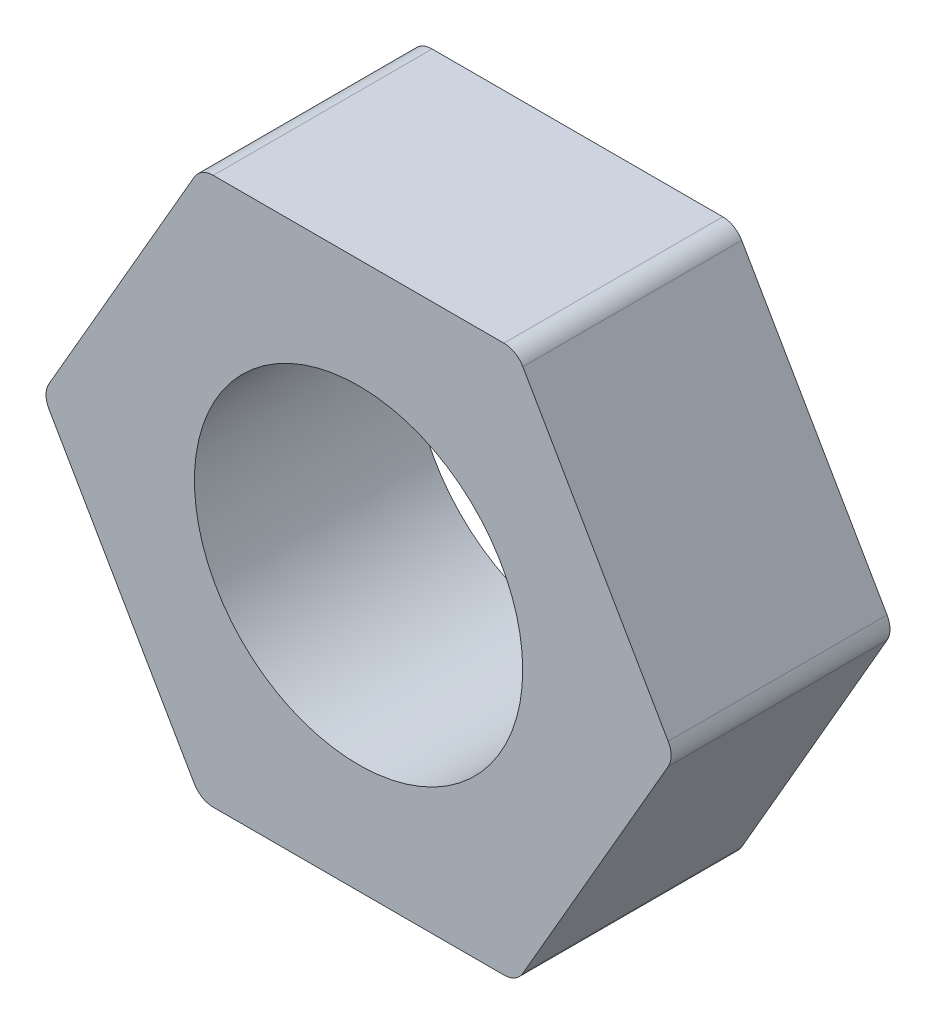
ISO-10303-21;
HEADER;
FILE_DESCRIPTION(('STEP AP214'),'2;1');
FILE_NAME('part.step','',(''),(''),'','','');
FILE_SCHEMA(('AUTOMOTIVE_DESIGN { 1 0 10303 214 1 1 1 1 }'));
ENDSEC;
DATA;
#1=APPLICATION_CONTEXT('core data for automotive mechanical design processes');
#2=APPLICATION_PROTOCOL_DEFINITION('international standard','automotive_design',2000,#1);
#3=PRODUCT_CONTEXT('',#1,'mechanical');
#4=PRODUCT('Part','Part','',(#3));
#5=PRODUCT_RELATED_PRODUCT_CATEGORY('part','',(#4));
#6=PRODUCT_DEFINITION_FORMATION('','',#4);
#7=PRODUCT_DEFINITION_CONTEXT('part definition',#1,'design');
#8=PRODUCT_DEFINITION('design','',#6,#7);
#9=PRODUCT_DEFINITION_SHAPE('','',#8);
#10=(LENGTH_UNIT() NAMED_UNIT(*) SI_UNIT(.MILLI.,.METRE.));
#11=(NAMED_UNIT(*) PLANE_ANGLE_UNIT() SI_UNIT($,.RADIAN.));
#12=(NAMED_UNIT(*) SI_UNIT($,.STERADIAN.) SOLID_ANGLE_UNIT());
#13=UNCERTAINTY_MEASURE_WITH_UNIT(LENGTH_MEASURE(1.E-05),#10,'distance_accuracy_value','');
#14=(GEOMETRIC_REPRESENTATION_CONTEXT(3) GLOBAL_UNCERTAINTY_ASSIGNED_CONTEXT((#13)) GLOBAL_UNIT_ASSIGNED_CONTEXT((#10,
#11,#12)) REPRESENTATION_CONTEXT('',''));
#15=CARTESIAN_POINT('',(0.,0.,0.));
#16=DIRECTION('',(0.,0.,1.));
#17=DIRECTION('',(1.,0.,0.));
#18=AXIS2_PLACEMENT_3D('',#15,#16,#17);
#19=CARTESIAN_POINT('',(485.116224765445,0.,40.));
#20=DIRECTION('',(0.,0.,-1.));
#21=DIRECTION('',(-1.,0.,0.));
#22=AXIS2_PLACEMENT_3D('',#19,#20,#21);
#23=CYLINDRICAL_SURFACE('',#22,4.00000000000002);
#24=CARTESIAN_POINT('',(485.116224765445,0.,0.));
#25=DIRECTION('',(0.,0.,1.));
#26=DIRECTION('',(1.,0.,0.));
#27=AXIS2_PLACEMENT_3D('',#24,#25,#26);
#28=CIRCLE('',#27,4.00000000000002);
#29=CARTESIAN_POINT('',(488.580326380583,2.00000000000006,0.));
#30=VERTEX_POINT('',#29);
#31=CARTESIAN_POINT('',(488.580326380583,-1.99999999999997,0.));
#32=VERTEX_POINT('',#31);
#33=EDGE_CURVE('E162',#30,#32,#28,.F.);
#34=ORIENTED_EDGE('',*,*,#33,.F.);
#35=DIRECTION('',(0.,0.,-1.));
#36=VECTOR('',#35,1.);
#37=CARTESIAN_POINT('',(488.580326380583,2.00000000000006,40.));
#38=LINE('',#37,#36);
#39=CARTESIAN_POINT('',(488.580326380583,2.00000000000006,40.));
#40=VERTEX_POINT('',#39);
#41=EDGE_CURVE('E11',#40,#30,#38,.T.);
#42=ORIENTED_EDGE('',*,*,#41,.F.);
#43=CARTESIAN_POINT('',(485.116224765445,0.,40.));
#44=DIRECTION('',(0.,0.,1.));
#45=DIRECTION('',(1.,0.,0.));
#46=AXIS2_PLACEMENT_3D('',#43,#44,#45);
#47=CIRCLE('',#46,4.00000000000002);
#48=CARTESIAN_POINT('',(488.580326380583,-1.99999999999997,40.));
#49=VERTEX_POINT('',#48);
#50=EDGE_CURVE('E188',#40,#49,#47,.F.);
#51=ORIENTED_EDGE('',*,*,#50,.T.);
#52=DIRECTION('',(0.,0.,-1.));
#53=VECTOR('',#52,1.);
#54=CARTESIAN_POINT('',(488.580326380583,-1.99999999999997,40.));
#55=LINE('',#54,#53);
#56=EDGE_CURVE('E104',#49,#32,#55,.T.);
#57=ORIENTED_EDGE('',*,*,#56,.T.);
#58=EDGE_LOOP('',(#34,#42,#51,#57));
#59=FACE_BOUND('',#58,.T.);
#60=ADVANCED_FACE('F41',(#59),#23,.T.);
#61=CARTESIAN_POINT('',(367.301270189222,212.061487217439,40.));
#62=DIRECTION('',(-0.866025403784438,-0.5,0.));
#63=DIRECTION('',(0.5,-0.866025403784438,0.));
#64=AXIS2_PLACEMENT_3D('',#61,#62,#63);
#65=PLANE('',#64);
#66=DIRECTION('',(-0.5,0.866025403784438,0.));
#67=VECTOR('',#66,1.);
#68=CARTESIAN_POINT('',(367.301270189222,212.061487217439,0.));
#69=LINE('',#68,#67);
#70=CARTESIAN_POINT('',(462.02221399786,48.,0.));
#71=VERTEX_POINT('',#70);
#72=EDGE_CURVE('E165',#30,#71,#69,.T.);
#73=ORIENTED_EDGE('',*,*,#72,.T.);
#74=DIRECTION('',(0.,0.,-1.));
#75=VECTOR('',#74,1.);
#76=CARTESIAN_POINT('',(462.02221399786,48.,40.));
#77=LINE('',#76,#75);
#78=CARTESIAN_POINT('',(462.02221399786,48.,40.));
#79=VERTEX_POINT('',#78);
#80=EDGE_CURVE('E49',#79,#71,#77,.T.);
#81=ORIENTED_EDGE('',*,*,#80,.F.);
#82=DIRECTION('',(-0.5,0.866025403784438,0.));
#83=VECTOR('',#82,1.);
#84=CARTESIAN_POINT('',(367.301270189222,212.061487217439,40.));
#85=LINE('',#84,#83);
#86=EDGE_CURVE('E258',#40,#79,#85,.T.);
#87=ORIENTED_EDGE('',*,*,#86,.F.);
#88=ORIENTED_EDGE('',*,*,#41,.T.);
#89=EDGE_LOOP('',(#73,#81,#87,#88));
#90=FACE_BOUND('',#89,.T.);
#91=ADVANCED_FACE('F261',(#90),#65,.F.);
#92=CARTESIAN_POINT('',(458.558112382723,46.,40.));
#93=DIRECTION('',(0.,0.,-1.));
#94=DIRECTION('',(-1.,0.,0.));
#95=AXIS2_PLACEMENT_3D('',#92,#93,#94);
#96=CYLINDRICAL_SURFACE('',#95,3.99999999999998);
#97=CARTESIAN_POINT('',(458.558112382723,46.,0.));
#98=DIRECTION('',(0.,0.,1.));
#99=DIRECTION('',(1.,0.,0.));
#100=AXIS2_PLACEMENT_3D('',#97,#98,#99);
#101=CIRCLE('',#100,3.99999999999998);
#102=CARTESIAN_POINT('',(458.558112382723,50.,0.));
#103=VERTEX_POINT('',#102);
#104=EDGE_CURVE('E167',#71,#103,#101,.T.);
#105=ORIENTED_EDGE('',*,*,#104,.T.);
#106=DIRECTION('',(0.,0.,-1.));
#107=VECTOR('',#106,1.);
#108=CARTESIAN_POINT('',(458.558112382723,50.,40.));
#109=LINE('',#108,#107);
#110=CARTESIAN_POINT('',(458.558112382723,50.,40.));
#111=VERTEX_POINT('',#110);
#112=EDGE_CURVE('E207',#111,#103,#109,.T.);
#113=ORIENTED_EDGE('',*,*,#112,.F.);
#114=CARTESIAN_POINT('',(458.558112382723,46.,40.));
#115=DIRECTION('',(0.,0.,1.));
#116=DIRECTION('',(1.,0.,0.));
#117=AXIS2_PLACEMENT_3D('',#114,#115,#116);
#118=CIRCLE('',#117,3.99999999999998);
#119=EDGE_CURVE('E216',#79,#111,#118,.T.);
#120=ORIENTED_EDGE('',*,*,#119,.F.);
#121=ORIENTED_EDGE('',*,*,#80,.T.);
#122=EDGE_LOOP('',(#105,#113,#120,#121));
#123=FACE_BOUND('',#122,.T.);
#124=ADVANCED_FACE('F214',(#123),#96,.T.);
#125=CARTESIAN_POINT('',(0.,50.,40.));
#126=DIRECTION('',(0.,-1.,0.));
#127=DIRECTION('',(0.,0.,-1.));
#128=AXIS2_PLACEMENT_3D('',#125,#126,#127);
#129=PLANE('',#128);
#130=DIRECTION('',(-1.,0.,0.));
#131=VECTOR('',#130,1.);
#132=CARTESIAN_POINT('',(0.,50.,0.));
#133=LINE('',#132,#131);
#134=CARTESIAN_POINT('',(405.441887617277,50.,0.));
#135=VERTEX_POINT('',#134);
#136=EDGE_CURVE('E169',#103,#135,#133,.T.);
#137=ORIENTED_EDGE('',*,*,#136,.T.);
#138=DIRECTION('',(0.,0.,-1.));
#139=VECTOR('',#138,1.);
#140=CARTESIAN_POINT('',(405.441887617277,50.,40.));
#141=LINE('',#140,#139);
#142=CARTESIAN_POINT('',(405.441887617277,50.,40.));
#143=VERTEX_POINT('',#142);
#144=EDGE_CURVE('E204',#143,#135,#141,.T.);
#145=ORIENTED_EDGE('',*,*,#144,.F.);
#146=DIRECTION('',(-1.,0.,0.));
#147=VECTOR('',#146,1.);
#148=CARTESIAN_POINT('',(0.,50.,40.));
#149=LINE('',#148,#147);
#150=EDGE_CURVE('E236',#111,#143,#149,.T.);
#151=ORIENTED_EDGE('',*,*,#150,.F.);
#152=ORIENTED_EDGE('',*,*,#112,.T.);
#153=EDGE_LOOP('',(#137,#145,#151,#152));
#154=FACE_BOUND('',#153,.T.);
#155=ADVANCED_FACE('F227',(#154),#129,.F.);
#156=CARTESIAN_POINT('',(405.441887617277,46.,40.));
#157=DIRECTION('',(0.,0.,-1.));
#158=DIRECTION('',(-1.,0.,0.));
#159=AXIS2_PLACEMENT_3D('',#156,#157,#158);
#160=CYLINDRICAL_SURFACE('',#159,3.99999999999998);
#161=CARTESIAN_POINT('',(405.441887617277,46.,0.));
#162=DIRECTION('',(0.,0.,1.));
#163=DIRECTION('',(1.,0.,0.));
#164=AXIS2_PLACEMENT_3D('',#161,#162,#163);
#165=CIRCLE('',#164,3.99999999999998);
#166=CARTESIAN_POINT('',(401.977786002139,48.,0.));
#167=VERTEX_POINT('',#166);
#168=EDGE_CURVE('E171',#135,#167,#165,.T.);
#169=ORIENTED_EDGE('',*,*,#168,.T.);
#170=DIRECTION('',(0.,0.,-1.));
#171=VECTOR('',#170,1.);
#172=CARTESIAN_POINT('',(401.977786002139,48.,40.));
#173=LINE('',#172,#171);
#174=CARTESIAN_POINT('',(401.977786002139,48.,40.));
#175=VERTEX_POINT('',#174);
#176=EDGE_CURVE('E201',#175,#167,#173,.T.);
#177=ORIENTED_EDGE('',*,*,#176,.F.);
#178=CARTESIAN_POINT('',(405.441887617277,46.,40.));
#179=DIRECTION('',(0.,0.,1.));
#180=DIRECTION('',(1.,0.,0.));
#181=AXIS2_PLACEMENT_3D('',#178,#179,#180);
#182=CIRCLE('',#181,3.99999999999998);
#183=EDGE_CURVE('E233',#143,#175,#182,.T.);
#184=ORIENTED_EDGE('',*,*,#183,.F.);
#185=ORIENTED_EDGE('',*,*,#144,.T.);
#186=EDGE_LOOP('',(#169,#177,#184,#185));
#187=FACE_BOUND('',#186,.T.);
#188=ADVANCED_FACE('F231',(#187),#160,.T.);
#189=CARTESIAN_POINT('',(280.698729810778,-162.061487217439,40.));
#190=DIRECTION('',(0.866025403784438,-0.500000000000001,0.));
#191=DIRECTION('',(0.500000000000001,0.866025403784438,0.));
#192=AXIS2_PLACEMENT_3D('',#189,#190,#191);
#193=PLANE('',#192);
#194=DIRECTION('',(-0.500000000000001,-0.866025403784438,0.));
#195=VECTOR('',#194,1.);
#196=CARTESIAN_POINT('',(280.698729810778,-162.061487217439,0.));
#197=LINE('',#196,#195);
#198=CARTESIAN_POINT('',(375.419673619417,2.,0.));
#199=VERTEX_POINT('',#198);
#200=EDGE_CURVE('E173',#167,#199,#197,.T.);
#201=ORIENTED_EDGE('',*,*,#200,.T.);
#202=DIRECTION('',(0.,0.,-1.));
#203=VECTOR('',#202,1.);
#204=CARTESIAN_POINT('',(375.419673619417,2.,40.));
#205=LINE('',#204,#203);
#206=CARTESIAN_POINT('',(375.419673619417,2.,40.));
#207=VERTEX_POINT('',#206);
#208=EDGE_CURVE('E198',#207,#199,#205,.T.);
#209=ORIENTED_EDGE('',*,*,#208,.F.);
#210=DIRECTION('',(-0.500000000000001,-0.866025403784438,0.));
#211=VECTOR('',#210,1.);
#212=CARTESIAN_POINT('',(280.698729810778,-162.061487217439,40.));
#213=LINE('',#212,#211);
#214=EDGE_CURVE('E235',#175,#207,#213,.T.);
#215=ORIENTED_EDGE('',*,*,#214,.F.);
#216=ORIENTED_EDGE('',*,*,#176,.T.);
#217=EDGE_LOOP('',(#201,#209,#215,#216));
#218=FACE_BOUND('',#217,.T.);
#219=ADVANCED_FACE('F273',(#218),#193,.F.);
#220=CARTESIAN_POINT('',(378.883775234554,0.,40.));
#221=DIRECTION('',(0.,0.,-1.));
#222=DIRECTION('',(-1.,0.,0.));
#223=AXIS2_PLACEMENT_3D('',#220,#221,#222);
#224=CYLINDRICAL_SURFACE('',#223,4.00000000000002);
#225=CARTESIAN_POINT('',(378.883775234554,0.,0.));
#226=DIRECTION('',(0.,0.,1.));
#227=DIRECTION('',(1.,0.,0.));
#228=AXIS2_PLACEMENT_3D('',#225,#226,#227);
#229=CIRCLE('',#228,4.00000000000002);
#230=CARTESIAN_POINT('',(375.419673619416,-2.00000000000003,0.));
#231=VERTEX_POINT('',#230);
#232=EDGE_CURVE('E175',#199,#231,#229,.T.);
#233=ORIENTED_EDGE('',*,*,#232,.T.);
#234=DIRECTION('',(0.,0.,-1.));
#235=VECTOR('',#234,1.);
#236=CARTESIAN_POINT('',(375.419673619416,-2.00000000000003,40.));
#237=LINE('',#236,#235);
#238=CARTESIAN_POINT('',(375.419673619416,-2.00000000000003,40.));
#239=VERTEX_POINT('',#238);
#240=EDGE_CURVE('E195',#239,#231,#237,.T.);
#241=ORIENTED_EDGE('',*,*,#240,.F.);
#242=CARTESIAN_POINT('',(378.883775234554,0.,40.));
#243=DIRECTION('',(0.,0.,1.));
#244=DIRECTION('',(1.,0.,0.));
#245=AXIS2_PLACEMENT_3D('',#242,#243,#244);
#246=CIRCLE('',#245,4.00000000000002);
#247=EDGE_CURVE('E238',#207,#239,#246,.T.);
#248=ORIENTED_EDGE('',*,*,#247,.F.);
#249=ORIENTED_EDGE('',*,*,#208,.T.);
#250=EDGE_LOOP('',(#233,#241,#248,#249));
#251=FACE_BOUND('',#250,.T.);
#252=ADVANCED_FACE('F276',(#251),#224,.T.);
#253=CARTESIAN_POINT('',(280.698729810777,162.061487217439,40.));
#254=DIRECTION('',(0.866025403784438,0.500000000000001,0.));
#255=DIRECTION('',(-0.500000000000001,0.866025403784438,0.));
#256=AXIS2_PLACEMENT_3D('',#253,#254,#255);
#257=PLANE('',#256);
#258=DIRECTION('',(0.500000000000001,-0.866025403784438,0.));
#259=VECTOR('',#258,1.);
#260=CARTESIAN_POINT('',(280.698729810777,162.061487217439,0.));
#261=LINE('',#260,#259);
#262=CARTESIAN_POINT('',(401.977786002139,-48.,0.));
#263=VERTEX_POINT('',#262);
#264=EDGE_CURVE('E177',#231,#263,#261,.T.);
#265=ORIENTED_EDGE('',*,*,#264,.T.);
#266=DIRECTION('',(0.,0.,-1.));
#267=VECTOR('',#266,1.);
#268=CARTESIAN_POINT('',(401.977786002139,-48.,40.));
#269=LINE('',#268,#267);
#270=CARTESIAN_POINT('',(401.977786002139,-48.,40.));
#271=VERTEX_POINT('',#270);
#272=EDGE_CURVE('E192',#271,#263,#269,.T.);
#273=ORIENTED_EDGE('',*,*,#272,.F.);
#274=DIRECTION('',(0.500000000000001,-0.866025403784438,0.));
#275=VECTOR('',#274,1.);
#276=CARTESIAN_POINT('',(280.698729810777,162.061487217439,40.));
#277=LINE('',#276,#275);
#278=EDGE_CURVE('E244',#239,#271,#277,.T.);
#279=ORIENTED_EDGE('',*,*,#278,.F.);
#280=ORIENTED_EDGE('',*,*,#240,.T.);
#281=EDGE_LOOP('',(#265,#273,#279,#280));
#282=FACE_BOUND('',#281,.T.);
#283=ADVANCED_FACE('F250',(#282),#257,.F.);
#284=CARTESIAN_POINT('',(405.441887617277,-46.0000000000001,40.));
#285=DIRECTION('',(0.,0.,-1.));
#286=DIRECTION('',(-1.,0.,0.));
#287=AXIS2_PLACEMENT_3D('',#284,#285,#286);
#288=CYLINDRICAL_SURFACE('',#287,3.99999999999998);
#289=CARTESIAN_POINT('',(405.441887617277,-46.0000000000001,0.));
#290=DIRECTION('',(0.,0.,1.));
#291=DIRECTION('',(1.,0.,0.));
#292=AXIS2_PLACEMENT_3D('',#289,#290,#291);
#293=CIRCLE('',#292,3.99999999999998);
#294=CARTESIAN_POINT('',(405.441887617277,-50.,0.));
#295=VERTEX_POINT('',#294);
#296=EDGE_CURVE('E179',#263,#295,#293,.T.);
#297=ORIENTED_EDGE('',*,*,#296,.T.);
#298=DIRECTION('',(0.,0.,-1.));
#299=VECTOR('',#298,1.);
#300=CARTESIAN_POINT('',(405.441887617277,-50.,40.));
#301=LINE('',#300,#299);
#302=CARTESIAN_POINT('',(405.441887617277,-50.,40.));
#303=VERTEX_POINT('',#302);
#304=EDGE_CURVE('E151',#303,#295,#301,.T.);
#305=ORIENTED_EDGE('',*,*,#304,.F.);
#306=CARTESIAN_POINT('',(405.441887617277,-46.0000000000001,40.));
#307=DIRECTION('',(0.,0.,1.));
#308=DIRECTION('',(1.,0.,0.));
#309=AXIS2_PLACEMENT_3D('',#306,#307,#308);
#310=CIRCLE('',#309,3.99999999999998);
#311=EDGE_CURVE('E142',#271,#303,#310,.T.);
#312=ORIENTED_EDGE('',*,*,#311,.F.);
#313=ORIENTED_EDGE('',*,*,#272,.T.);
#314=EDGE_LOOP('',(#297,#305,#312,#313));
#315=FACE_BOUND('',#314,.T.);
#316=ADVANCED_FACE('F254',(#315),#288,.T.);
#317=CARTESIAN_POINT('',(0.,-50.,40.));
#318=DIRECTION('',(0.,1.,0.));
#319=DIRECTION('',(-1.,0.,0.));
#320=AXIS2_PLACEMENT_3D('',#317,#318,#319);
#321=PLANE('',#320);
#322=DIRECTION('',(1.,0.,0.));
#323=VECTOR('',#322,1.);
#324=CARTESIAN_POINT('',(0.,-50.,0.));
#325=LINE('',#324,#323);
#326=CARTESIAN_POINT('',(458.558112382723,-50.0000000000001,0.));
#327=VERTEX_POINT('',#326);
#328=EDGE_CURVE('E150',#295,#327,#325,.T.);
#329=ORIENTED_EDGE('',*,*,#328,.T.);
#330=DIRECTION('',(0.,0.,-1.));
#331=VECTOR('',#330,1.);
#332=CARTESIAN_POINT('',(458.558112382723,-50.0000000000001,40.));
#333=LINE('',#332,#331);
#334=CARTESIAN_POINT('',(458.558112382723,-50.0000000000001,40.));
#335=VERTEX_POINT('',#334);
#336=EDGE_CURVE('E147',#335,#327,#333,.T.);
#337=ORIENTED_EDGE('',*,*,#336,.F.);
#338=DIRECTION('',(1.,0.,0.));
#339=VECTOR('',#338,1.);
#340=CARTESIAN_POINT('',(0.,-50.,40.));
#341=LINE('',#340,#339);
#342=EDGE_CURVE('E135',#303,#335,#341,.T.);
#343=ORIENTED_EDGE('',*,*,#342,.F.);
#344=ORIENTED_EDGE('',*,*,#304,.T.);
#345=EDGE_LOOP('',(#329,#337,#343,#344));
#346=FACE_BOUND('',#345,.T.);
#347=ADVANCED_FACE('F148',(#346),#321,.F.);
#348=CARTESIAN_POINT('',(458.558112382723,-46.0000000000001,40.));
#349=DIRECTION('',(0.,0.,-1.));
#350=DIRECTION('',(-1.,0.,0.));
#351=AXIS2_PLACEMENT_3D('',#348,#349,#350);
#352=CYLINDRICAL_SURFACE('',#351,3.99999999999998);
#353=CARTESIAN_POINT('',(458.558112382723,-46.0000000000001,0.));
#354=DIRECTION('',(0.,0.,1.));
#355=DIRECTION('',(1.,0.,0.));
#356=AXIS2_PLACEMENT_3D('',#353,#354,#355);
#357=CIRCLE('',#356,3.99999999999998);
#358=CARTESIAN_POINT('',(462.02221399786,-48.,0.));
#359=VERTEX_POINT('',#358);
#360=EDGE_CURVE('E97',#327,#359,#357,.T.);
#361=ORIENTED_EDGE('',*,*,#360,.T.);
#362=DIRECTION('',(0.,0.,-1.));
#363=VECTOR('',#362,1.);
#364=CARTESIAN_POINT('',(462.02221399786,-48.,40.));
#365=LINE('',#364,#363);
#366=CARTESIAN_POINT('',(462.02221399786,-48.,40.));
#367=VERTEX_POINT('',#366);
#368=EDGE_CURVE('E152',#367,#359,#365,.T.);
#369=ORIENTED_EDGE('',*,*,#368,.F.);
#370=CARTESIAN_POINT('',(458.558112382723,-46.0000000000001,40.));
#371=DIRECTION('',(0.,0.,1.));
#372=DIRECTION('',(1.,0.,0.));
#373=AXIS2_PLACEMENT_3D('',#370,#371,#372);
#374=CIRCLE('',#373,3.99999999999998);
#375=EDGE_CURVE('E140',#335,#367,#374,.T.);
#376=ORIENTED_EDGE('',*,*,#375,.F.);
#377=ORIENTED_EDGE('',*,*,#336,.T.);
#378=EDGE_LOOP('',(#361,#369,#376,#377));
#379=FACE_BOUND('',#378,.T.);
#380=ADVANCED_FACE('F154',(#379),#352,.T.);
#381=CARTESIAN_POINT('',(367.301270189222,-212.061487217439,40.));
#382=DIRECTION('',(-0.866025403784439,0.5,0.));
#383=DIRECTION('',(-0.5,-0.866025403784439,0.));
#384=AXIS2_PLACEMENT_3D('',#381,#382,#383);
#385=PLANE('',#384);
#386=DIRECTION('',(0.5,0.866025403784439,0.));
#387=VECTOR('',#386,1.);
#388=CARTESIAN_POINT('',(367.301270189222,-212.061487217439,0.));
#389=LINE('',#388,#387);
#390=EDGE_CURVE('E183',#359,#32,#389,.T.);
#391=ORIENTED_EDGE('',*,*,#390,.T.);
#392=ORIENTED_EDGE('',*,*,#56,.F.);
#393=DIRECTION('',(0.5,0.866025403784439,0.));
#394=VECTOR('',#393,1.);
#395=CARTESIAN_POINT('',(367.301270189222,-212.061487217439,40.));
#396=LINE('',#395,#394);
#397=EDGE_CURVE('E57',#367,#49,#396,.T.);
#398=ORIENTED_EDGE('',*,*,#397,.F.);
#399=ORIENTED_EDGE('',*,*,#368,.T.);
#400=EDGE_LOOP('',(#391,#392,#398,#399));
#401=FACE_BOUND('',#400,.T.);
#402=ADVANCED_FACE('F257',(#401),#385,.F.);
#403=CARTESIAN_POINT('',(432.,0.,40.));
#404=DIRECTION('',(0.,0.,-1.));
#405=DIRECTION('',(-1.,0.,0.));
#406=AXIS2_PLACEMENT_3D('',#403,#404,#405);
#407=CYLINDRICAL_SURFACE('',#406,30.);
#408=CARTESIAN_POINT('',(432.,0.,40.));
#409=DIRECTION('',(0.,0.,1.));
#410=DIRECTION('',(1.,0.,0.));
#411=AXIS2_PLACEMENT_3D('',#408,#409,#410);
#412=CIRCLE('',#411,30.);
#413=CARTESIAN_POINT('',(462.,0.,40.));
#414=VERTEX_POINT('',#413);
#415=EDGE_CURVE('E156',#414,#414,#412,.F.);
#416=ORIENTED_EDGE('',*,*,#415,.F.);
#417=EDGE_LOOP('',(#416));
#418=FACE_BOUND('',#417,.T.);
#419=CARTESIAN_POINT('',(432.,0.,0.));
#420=DIRECTION('',(0.,0.,1.));
#421=DIRECTION('',(1.,0.,0.));
#422=AXIS2_PLACEMENT_3D('',#419,#420,#421);
#423=CIRCLE('',#422,30.);
#424=CARTESIAN_POINT('',(462.,0.,0.));
#425=VERTEX_POINT('',#424);
#426=EDGE_CURVE('E185',#425,#425,#423,.F.);
#427=ORIENTED_EDGE('',*,*,#426,.T.);
#428=EDGE_LOOP('',(#427));
#429=FACE_BOUND('',#428,.T.);
#430=ADVANCED_FACE('F291',(#418,#429),#407,.F.);
#431=CARTESIAN_POINT('',(0.,0.,40.));
#432=DIRECTION('',(0.,0.,1.));
#433=DIRECTION('',(1.,0.,0.));
#434=AXIS2_PLACEMENT_3D('',#431,#432,#433);
#435=PLANE('',#434);
#436=ORIENTED_EDGE('',*,*,#50,.F.);
#437=ORIENTED_EDGE('',*,*,#86,.T.);
#438=ORIENTED_EDGE('',*,*,#119,.T.);
#439=ORIENTED_EDGE('',*,*,#150,.T.);
#440=ORIENTED_EDGE('',*,*,#183,.T.);
#441=ORIENTED_EDGE('',*,*,#214,.T.);
#442=ORIENTED_EDGE('',*,*,#247,.T.);
#443=ORIENTED_EDGE('',*,*,#278,.T.);
#444=ORIENTED_EDGE('',*,*,#311,.T.);
#445=ORIENTED_EDGE('',*,*,#342,.T.);
#446=ORIENTED_EDGE('',*,*,#375,.T.);
#447=ORIENTED_EDGE('',*,*,#397,.T.);
#448=EDGE_LOOP('',(#436,#437,#438,#439,#440,#441,#442,#443,#444,#445,#446,#447));
#449=FACE_BOUND('',#448,.T.);
#450=ORIENTED_EDGE('',*,*,#415,.T.);
#451=EDGE_LOOP('',(#450));
#452=FACE_BOUND('',#451,.T.);
#453=ADVANCED_FACE('F137',(#449,#452),#435,.T.);
#454=CARTESIAN_POINT('',(0.,0.,0.));
#455=DIRECTION('',(0.,0.,1.));
#456=DIRECTION('',(1.,0.,0.));
#457=AXIS2_PLACEMENT_3D('',#454,#455,#456);
#458=PLANE('',#457);
#459=ORIENTED_EDGE('',*,*,#33,.T.);
#460=ORIENTED_EDGE('',*,*,#390,.F.);
#461=ORIENTED_EDGE('',*,*,#360,.F.);
#462=ORIENTED_EDGE('',*,*,#328,.F.);
#463=ORIENTED_EDGE('',*,*,#296,.F.);
#464=ORIENTED_EDGE('',*,*,#264,.F.);
#465=ORIENTED_EDGE('',*,*,#232,.F.);
#466=ORIENTED_EDGE('',*,*,#200,.F.);
#467=ORIENTED_EDGE('',*,*,#168,.F.);
#468=ORIENTED_EDGE('',*,*,#136,.F.);
#469=ORIENTED_EDGE('',*,*,#104,.F.);
#470=ORIENTED_EDGE('',*,*,#72,.F.);
#471=EDGE_LOOP('',(#459,#460,#461,#462,#463,#464,#465,#466,#467,#468,#469,#470));
#472=FACE_BOUND('',#471,.T.);
#473=ORIENTED_EDGE('',*,*,#426,.F.);
#474=EDGE_LOOP('',(#473));
#475=FACE_BOUND('',#474,.T.);
#476=ADVANCED_FACE('F221',(#472,#475),#458,.F.);
#477=CLOSED_SHELL('',(#60,#91,#124,#155,#188,#219,#252,#283,#316,#347,#380,#402,#430,#453,#476));
#478=MANIFOLD_SOLID_BREP('B2',#477);
#479=ADVANCED_BREP_SHAPE_REPRESENTATION('',(#18,#478),#14);
#480=SHAPE_DEFINITION_REPRESENTATION(#9,#479);
ENDSEC;
END-ISO-10303-21;
